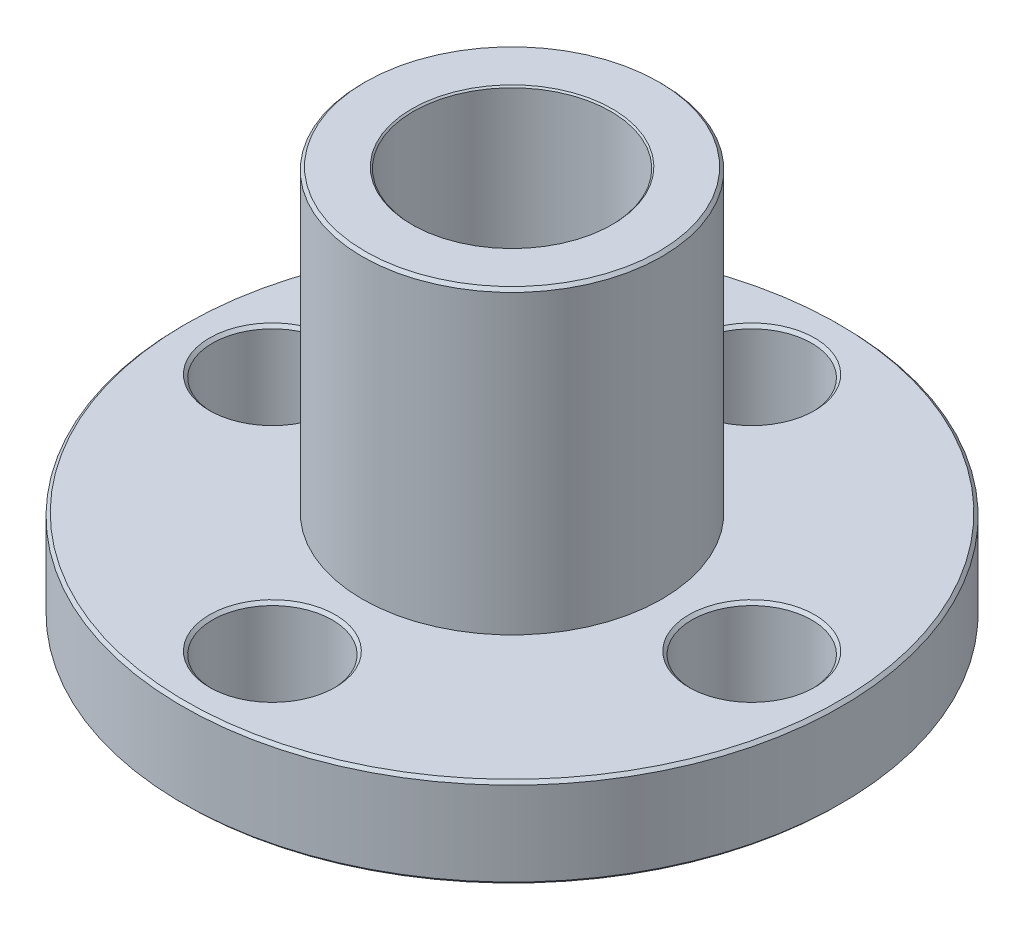
ISO-10303-21;
HEADER;
FILE_DESCRIPTION(('STEP AP214'),'2;1');
FILE_NAME('part.step','',(''),(''),'','','');
FILE_SCHEMA(('AUTOMOTIVE_DESIGN { 1 0 10303 214 1 1 1 1 }'));
ENDSEC;
DATA;
#1=APPLICATION_CONTEXT('core data for automotive mechanical design processes');
#2=APPLICATION_PROTOCOL_DEFINITION('international standard','automotive_design',2000,#1);
#3=PRODUCT_CONTEXT('',#1,'mechanical');
#4=PRODUCT('Part','Part','',(#3));
#5=PRODUCT_RELATED_PRODUCT_CATEGORY('part','',(#4));
#6=PRODUCT_DEFINITION_FORMATION('','',#4);
#7=PRODUCT_DEFINITION_CONTEXT('part definition',#1,'design');
#8=PRODUCT_DEFINITION('design','',#6,#7);
#9=PRODUCT_DEFINITION_SHAPE('','',#8);
#10=(LENGTH_UNIT() NAMED_UNIT(*) SI_UNIT(.MILLI.,.METRE.));
#11=(NAMED_UNIT(*) PLANE_ANGLE_UNIT() SI_UNIT($,.RADIAN.));
#12=(NAMED_UNIT(*) SI_UNIT($,.STERADIAN.) SOLID_ANGLE_UNIT());
#13=UNCERTAINTY_MEASURE_WITH_UNIT(LENGTH_MEASURE(1.E-05),#10,'distance_accuracy_value','');
#14=(GEOMETRIC_REPRESENTATION_CONTEXT(3) GLOBAL_UNCERTAINTY_ASSIGNED_CONTEXT((#13)) GLOBAL_UNIT_ASSIGNED_CONTEXT((#10,
#11,#12)) REPRESENTATION_CONTEXT('',''));
#15=CARTESIAN_POINT('',(0.,0.,0.));
#16=DIRECTION('',(0.,0.,1.));
#17=DIRECTION('',(1.,0.,0.));
#18=AXIS2_PLACEMENT_3D('',#15,#16,#17);
#19=CARTESIAN_POINT('',(0.,0.,0.));
#20=DIRECTION('',(0.,1.,0.));
#21=DIRECTION('',(1.,0.,0.));
#22=AXIS2_PLACEMENT_3D('',#19,#20,#21);
#23=CYLINDRICAL_SURFACE('',#22,5.);
#24=CARTESIAN_POINT('',(0.,12.9,0.));
#25=DIRECTION('',(0.,1.,0.));
#26=DIRECTION('',(1.,0.,0.));
#27=AXIS2_PLACEMENT_3D('',#24,#25,#26);
#28=CIRCLE('',#27,5.);
#29=CARTESIAN_POINT('',(-5.,12.9,0.));
#30=VERTEX_POINT('',#29);
#31=EDGE_CURVE('E26',#30,#30,#28,.T.);
#32=ORIENTED_EDGE('',*,*,#31,.F.);
#33=DIRECTION('',(0.,-1.,0.));
#34=VECTOR('',#33,1.);
#35=CARTESIAN_POINT('',(-5.,0.,0.));
#36=LINE('',#35,#34);
#37=CARTESIAN_POINT('',(-5.,3.,0.));
#38=VERTEX_POINT('',#37);
#39=EDGE_CURVE('E10',#30,#38,#36,.T.);
#40=ORIENTED_EDGE('',*,*,#39,.T.);
#41=CARTESIAN_POINT('',(0.,3.,0.));
#42=DIRECTION('',(0.,-1.,0.));
#43=DIRECTION('',(1.,0.,0.));
#44=AXIS2_PLACEMENT_3D('',#41,#42,#43);
#45=CIRCLE('',#44,5.);
#46=EDGE_CURVE('E60',#38,#38,#45,.T.);
#47=ORIENTED_EDGE('',*,*,#46,.F.);
#48=ORIENTED_EDGE('',*,*,#39,.F.);
#49=EDGE_LOOP('',(#32,#40,#47,#48));
#50=FACE_BOUND('',#49,.T.);
#51=ADVANCED_FACE('F15',(#50),#23,.T.);
#52=CARTESIAN_POINT('',(0.,12.95,0.));
#53=DIRECTION('',(0.,-1.,0.));
#54=DIRECTION('',(1.,0.,0.));
#55=AXIS2_PLACEMENT_3D('',#52,#53,#54);
#56=CONICAL_SURFACE('',#55,4.95,0.785398163397448);
#57=CARTESIAN_POINT('',(0.,13.,0.));
#58=DIRECTION('',(0.,-1.,0.));
#59=DIRECTION('',(1.,0.,0.));
#60=AXIS2_PLACEMENT_3D('',#57,#58,#59);
#61=CIRCLE('',#60,4.9);
#62=CARTESIAN_POINT('',(-4.9,13.,0.));
#63=VERTEX_POINT('',#62);
#64=EDGE_CURVE('E173',#63,#63,#61,.T.);
#65=ORIENTED_EDGE('',*,*,#64,.T.);
#66=DIRECTION('',(-0.707106781186548,-0.707106781186548,0.));
#67=VECTOR('',#66,1.);
#68=CARTESIAN_POINT('',(-4.95,12.95,0.));
#69=LINE('',#68,#67);
#70=EDGE_CURVE('E125',#63,#30,#69,.T.);
#71=ORIENTED_EDGE('',*,*,#70,.T.);
#72=ORIENTED_EDGE('',*,*,#31,.T.);
#73=ORIENTED_EDGE('',*,*,#70,.F.);
#74=EDGE_LOOP('',(#65,#71,#72,#73));
#75=FACE_BOUND('',#74,.T.);
#76=ADVANCED_FACE('F476',(#75),#56,.T.);
#77=CARTESIAN_POINT('',(0.,2.95,0.));
#78=DIRECTION('',(0.,-1.,0.));
#79=DIRECTION('',(1.,0.,0.));
#80=AXIS2_PLACEMENT_3D('',#77,#78,#79);
#81=CONICAL_SURFACE('',#80,10.95,0.785398163397448);
#82=CARTESIAN_POINT('',(0.,3.,0.));
#83=DIRECTION('',(0.,-1.,0.));
#84=DIRECTION('',(1.,0.,0.));
#85=AXIS2_PLACEMENT_3D('',#82,#83,#84);
#86=CIRCLE('',#85,10.9);
#87=CARTESIAN_POINT('',(-10.9,3.,0.));
#88=VERTEX_POINT('',#87);
#89=EDGE_CURVE('E90',#88,#88,#86,.T.);
#90=ORIENTED_EDGE('',*,*,#89,.T.);
#91=DIRECTION('',(-0.707106781186548,-0.707106781186548,0.));
#92=VECTOR('',#91,1.);
#93=CARTESIAN_POINT('',(-10.95,2.95,0.));
#94=LINE('',#93,#92);
#95=CARTESIAN_POINT('',(-11.,2.9,0.));
#96=VERTEX_POINT('',#95);
#97=EDGE_CURVE('E19',#88,#96,#94,.T.);
#98=ORIENTED_EDGE('',*,*,#97,.T.);
#99=CARTESIAN_POINT('',(0.,2.9,0.));
#100=DIRECTION('',(0.,1.,0.));
#101=DIRECTION('',(1.,0.,0.));
#102=AXIS2_PLACEMENT_3D('',#99,#100,#101);
#103=CIRCLE('',#102,11.);
#104=EDGE_CURVE('E187',#96,#96,#103,.T.);
#105=ORIENTED_EDGE('',*,*,#104,.T.);
#106=ORIENTED_EDGE('',*,*,#97,.F.);
#107=EDGE_LOOP('',(#90,#98,#105,#106));
#108=FACE_BOUND('',#107,.T.);
#109=ADVANCED_FACE('F218',(#108),#81,.T.);
#110=CARTESIAN_POINT('',(-8.00000011920929,0.,0.));
#111=DIRECTION('',(0.,1.,0.));
#112=DIRECTION('',(1.,0.,0.));
#113=AXIS2_PLACEMENT_3D('',#110,#111,#112);
#114=CYLINDRICAL_SURFACE('',#113,2.);
#115=CARTESIAN_POINT('',(-8.00000011920929,2.9,0.));
#116=DIRECTION('',(0.,-1.,0.));
#117=DIRECTION('',(1.,0.,0.));
#118=AXIS2_PLACEMENT_3D('',#115,#116,#117);
#119=CIRCLE('',#118,2.);
#120=CARTESIAN_POINT('',(-10.0000001192093,2.9,0.));
#121=VERTEX_POINT('',#120);
#122=EDGE_CURVE('E114',#121,#121,#119,.T.);
#123=ORIENTED_EDGE('',*,*,#122,.F.);
#124=DIRECTION('',(0.,-1.,0.));
#125=VECTOR('',#124,1.);
#126=CARTESIAN_POINT('',(-10.0000001192093,0.,0.));
#127=LINE('',#126,#125);
#128=CARTESIAN_POINT('',(-10.0000001192093,0.,0.));
#129=VERTEX_POINT('',#128);
#130=EDGE_CURVE('E115',#121,#129,#127,.T.);
#131=ORIENTED_EDGE('',*,*,#130,.T.);
#132=CARTESIAN_POINT('',(-8.00000011920929,0.,0.));
#133=DIRECTION('',(0.,-1.,0.));
#134=DIRECTION('',(1.,0.,0.));
#135=AXIS2_PLACEMENT_3D('',#132,#133,#134);
#136=CIRCLE('',#135,2.);
#137=EDGE_CURVE('E84',#129,#129,#136,.T.);
#138=ORIENTED_EDGE('',*,*,#137,.T.);
#139=ORIENTED_EDGE('',*,*,#130,.F.);
#140=EDGE_LOOP('',(#123,#131,#138,#139));
#141=FACE_BOUND('',#140,.T.);
#142=ADVANCED_FACE('F508',(#141),#114,.F.);
#143=CARTESIAN_POINT('',(-8.00000011920929,2.95,0.));
#144=DIRECTION('',(0.,1.,0.));
#145=DIRECTION('',(1.,0.,0.));
#146=AXIS2_PLACEMENT_3D('',#143,#144,#145);
#147=CONICAL_SURFACE('',#146,2.05,0.785398163397448);
#148=CARTESIAN_POINT('',(-8.00000011920929,3.,0.));
#149=DIRECTION('',(0.,1.,0.));
#150=DIRECTION('',(1.,0.,0.));
#151=AXIS2_PLACEMENT_3D('',#148,#149,#150);
#152=CIRCLE('',#151,2.1);
#153=CARTESIAN_POINT('',(-10.1000001192093,3.,0.));
#154=VERTEX_POINT('',#153);
#155=EDGE_CURVE('E67',#154,#154,#152,.T.);
#156=ORIENTED_EDGE('',*,*,#155,.T.);
#157=DIRECTION('',(0.707106781186548,-0.707106781186548,0.));
#158=VECTOR('',#157,1.);
#159=CARTESIAN_POINT('',(-10.0500001192093,2.95,0.));
#160=LINE('',#159,#158);
#161=EDGE_CURVE('E110',#154,#121,#160,.T.);
#162=ORIENTED_EDGE('',*,*,#161,.T.);
#163=ORIENTED_EDGE('',*,*,#122,.T.);
#164=ORIENTED_EDGE('',*,*,#161,.F.);
#165=EDGE_LOOP('',(#156,#162,#163,#164));
#166=FACE_BOUND('',#165,.T.);
#167=ADVANCED_FACE('F513',(#166),#147,.F.);
#168=CARTESIAN_POINT('',(0.,2.95,8.00000011920929));
#169=DIRECTION('',(0.,1.,0.));
#170=DIRECTION('',(1.,0.,0.));
#171=AXIS2_PLACEMENT_3D('',#168,#169,#170);
#172=CONICAL_SURFACE('',#171,2.05,0.785398163397448);
#173=CARTESIAN_POINT('',(0.,3.,8.00000011920929));
#174=DIRECTION('',(0.,1.,0.));
#175=DIRECTION('',(1.,0.,0.));
#176=AXIS2_PLACEMENT_3D('',#173,#174,#175);
#177=CIRCLE('',#176,2.1);
#178=CARTESIAN_POINT('',(-2.1,3.,8.00000011920929));
#179=VERTEX_POINT('',#178);
#180=EDGE_CURVE('E66',#179,#179,#177,.T.);
#181=ORIENTED_EDGE('',*,*,#180,.T.);
#182=DIRECTION('',(0.707106781186548,-0.707106781186548,0.));
#183=VECTOR('',#182,1.);
#184=CARTESIAN_POINT('',(-2.05,2.95,8.00000011920929));
#185=LINE('',#184,#183);
#186=CARTESIAN_POINT('',(-2.,2.9,8.00000011920929));
#187=VERTEX_POINT('',#186);
#188=EDGE_CURVE('E99',#179,#187,#185,.T.);
#189=ORIENTED_EDGE('',*,*,#188,.T.);
#190=CARTESIAN_POINT('',(0.,2.9,8.00000011920929));
#191=DIRECTION('',(0.,-1.,0.));
#192=DIRECTION('',(1.,0.,0.));
#193=AXIS2_PLACEMENT_3D('',#190,#191,#192);
#194=CIRCLE('',#193,2.);
#195=EDGE_CURVE('E82',#187,#187,#194,.T.);
#196=ORIENTED_EDGE('',*,*,#195,.T.);
#197=ORIENTED_EDGE('',*,*,#188,.F.);
#198=EDGE_LOOP('',(#181,#189,#196,#197));
#199=FACE_BOUND('',#198,.T.);
#200=ADVANCED_FACE('F504',(#199),#172,.F.);
#201=CARTESIAN_POINT('',(0.,0.,-8.00000011920929));
#202=DIRECTION('',(0.,1.,0.));
#203=DIRECTION('',(1.,0.,0.));
#204=AXIS2_PLACEMENT_3D('',#201,#202,#203);
#205=CYLINDRICAL_SURFACE('',#204,2.);
#206=CARTESIAN_POINT('',(0.,2.9,-8.00000011920929));
#207=DIRECTION('',(0.,-1.,0.));
#208=DIRECTION('',(1.,0.,0.));
#209=AXIS2_PLACEMENT_3D('',#206,#207,#208);
#210=CIRCLE('',#209,2.);
#211=CARTESIAN_POINT('',(-2.,2.9,-8.00000011920929));
#212=VERTEX_POINT('',#211);
#213=EDGE_CURVE('E100',#212,#212,#210,.T.);
#214=ORIENTED_EDGE('',*,*,#213,.F.);
#215=DIRECTION('',(0.,-1.,0.));
#216=VECTOR('',#215,1.);
#217=CARTESIAN_POINT('',(-2.,0.,-8.00000011920929));
#218=LINE('',#217,#216);
#219=CARTESIAN_POINT('',(-2.,0.,-8.00000011920929));
#220=VERTEX_POINT('',#219);
#221=EDGE_CURVE('E95',#212,#220,#218,.T.);
#222=ORIENTED_EDGE('',*,*,#221,.T.);
#223=CARTESIAN_POINT('',(0.,0.,-8.00000011920929));
#224=DIRECTION('',(0.,-1.,0.));
#225=DIRECTION('',(1.,0.,0.));
#226=AXIS2_PLACEMENT_3D('',#223,#224,#225);
#227=CIRCLE('',#226,2.);
#228=EDGE_CURVE('E88',#220,#220,#227,.T.);
#229=ORIENTED_EDGE('',*,*,#228,.T.);
#230=ORIENTED_EDGE('',*,*,#221,.F.);
#231=EDGE_LOOP('',(#214,#222,#229,#230));
#232=FACE_BOUND('',#231,.T.);
#233=ADVANCED_FACE('F511',(#232),#205,.F.);
#234=CARTESIAN_POINT('',(0.,2.95,-8.00000011920929));
#235=DIRECTION('',(0.,1.,0.));
#236=DIRECTION('',(1.,0.,0.));
#237=AXIS2_PLACEMENT_3D('',#234,#235,#236);
#238=CONICAL_SURFACE('',#237,2.05,0.785398163397448);
#239=CARTESIAN_POINT('',(0.,3.,-8.00000011920929));
#240=DIRECTION('',(0.,1.,0.));
#241=DIRECTION('',(1.,0.,0.));
#242=AXIS2_PLACEMENT_3D('',#239,#240,#241);
#243=CIRCLE('',#242,2.1);
#244=CARTESIAN_POINT('',(-2.1,3.,-8.00000011920929));
#245=VERTEX_POINT('',#244);
#246=EDGE_CURVE('E78',#245,#245,#243,.T.);
#247=ORIENTED_EDGE('',*,*,#246,.T.);
#248=DIRECTION('',(0.707106781186548,-0.707106781186548,0.));
#249=VECTOR('',#248,1.);
#250=CARTESIAN_POINT('',(-2.05,2.95,-8.00000011920929));
#251=LINE('',#250,#249);
#252=EDGE_CURVE('E75',#245,#212,#251,.T.);
#253=ORIENTED_EDGE('',*,*,#252,.T.);
#254=ORIENTED_EDGE('',*,*,#213,.T.);
#255=ORIENTED_EDGE('',*,*,#252,.F.);
#256=EDGE_LOOP('',(#247,#253,#254,#255));
#257=FACE_BOUND('',#256,.T.);
#258=ADVANCED_FACE('F202',(#257),#238,.F.);
#259=CARTESIAN_POINT('',(0.,3.,0.));
#260=DIRECTION('',(0.,1.,0.));
#261=DIRECTION('',(1.,0.,0.));
#262=AXIS2_PLACEMENT_3D('',#259,#260,#261);
#263=PLANE('',#262);
#264=CARTESIAN_POINT('',(8.00000011920929,3.,0.));
#265=DIRECTION('',(0.,1.,0.));
#266=DIRECTION('',(1.,0.,0.));
#267=AXIS2_PLACEMENT_3D('',#264,#265,#266);
#268=CIRCLE('',#267,2.1);
#269=CARTESIAN_POINT('',(5.90000011920929,3.,0.));
#270=VERTEX_POINT('',#269);
#271=EDGE_CURVE('E194',#270,#270,#268,.T.);
#272=ORIENTED_EDGE('',*,*,#271,.F.);
#273=EDGE_LOOP('',(#272));
#274=FACE_BOUND('',#273,.T.);
#275=ORIENTED_EDGE('',*,*,#180,.F.);
#276=EDGE_LOOP('',(#275));
#277=FACE_BOUND('',#276,.T.);
#278=ORIENTED_EDGE('',*,*,#46,.T.);
#279=EDGE_LOOP('',(#278));
#280=FACE_BOUND('',#279,.T.);
#281=ORIENTED_EDGE('',*,*,#155,.F.);
#282=EDGE_LOOP('',(#281));
#283=FACE_BOUND('',#282,.T.);
#284=ORIENTED_EDGE('',*,*,#246,.F.);
#285=EDGE_LOOP('',(#284));
#286=FACE_BOUND('',#285,.T.);
#287=ORIENTED_EDGE('',*,*,#89,.F.);
#288=EDGE_LOOP('',(#287));
#289=FACE_BOUND('',#288,.T.);
#290=ADVANCED_FACE('F63',(#274,#277,#280,#283,#286,#289),#263,.T.);
#291=CARTESIAN_POINT('',(8.00000011920929,2.95,0.));
#292=DIRECTION('',(0.,1.,0.));
#293=DIRECTION('',(1.,0.,0.));
#294=AXIS2_PLACEMENT_3D('',#291,#292,#293);
#295=CONICAL_SURFACE('',#294,2.05,0.785398163397448);
#296=ORIENTED_EDGE('',*,*,#271,.T.);
#297=DIRECTION('',(0.707106781186548,-0.707106781186548,0.));
#298=VECTOR('',#297,1.);
#299=CARTESIAN_POINT('',(5.95000011920929,2.95,0.));
#300=LINE('',#299,#298);
#301=CARTESIAN_POINT('',(6.00000011920929,2.9,0.));
#302=VERTEX_POINT('',#301);
#303=EDGE_CURVE('E93',#270,#302,#300,.T.);
#304=ORIENTED_EDGE('',*,*,#303,.T.);
#305=CARTESIAN_POINT('',(8.00000011920929,2.9,0.));
#306=DIRECTION('',(0.,-1.,0.));
#307=DIRECTION('',(1.,0.,0.));
#308=AXIS2_PLACEMENT_3D('',#305,#306,#307);
#309=CIRCLE('',#308,2.);
#310=EDGE_CURVE('E151',#302,#302,#309,.T.);
#311=ORIENTED_EDGE('',*,*,#310,.T.);
#312=ORIENTED_EDGE('',*,*,#303,.F.);
#313=EDGE_LOOP('',(#296,#304,#311,#312));
#314=FACE_BOUND('',#313,.T.);
#315=ADVANCED_FACE('F209',(#314),#295,.F.);
#316=CARTESIAN_POINT('',(0.,0.,0.));
#317=DIRECTION('',(0.,1.,0.));
#318=DIRECTION('',(1.,0.,0.));
#319=AXIS2_PLACEMENT_3D('',#316,#317,#318);
#320=CYLINDRICAL_SURFACE('',#319,11.);
#321=ORIENTED_EDGE('',*,*,#104,.F.);
#322=DIRECTION('',(0.,-1.,0.));
#323=VECTOR('',#322,1.);
#324=CARTESIAN_POINT('',(-11.,0.,0.));
#325=LINE('',#324,#323);
#326=CARTESIAN_POINT('',(-11.,0.1,0.));
#327=VERTEX_POINT('',#326);
#328=EDGE_CURVE('E191',#96,#327,#325,.T.);
#329=ORIENTED_EDGE('',*,*,#328,.T.);
#330=CARTESIAN_POINT('',(0.,0.1,0.));
#331=DIRECTION('',(0.,-1.,0.));
#332=DIRECTION('',(1.,0.,0.));
#333=AXIS2_PLACEMENT_3D('',#330,#331,#332);
#334=CIRCLE('',#333,11.);
#335=EDGE_CURVE('E152',#327,#327,#334,.T.);
#336=ORIENTED_EDGE('',*,*,#335,.F.);
#337=ORIENTED_EDGE('',*,*,#328,.F.);
#338=EDGE_LOOP('',(#321,#329,#336,#337));
#339=FACE_BOUND('',#338,.T.);
#340=ADVANCED_FACE('F437',(#339),#320,.T.);
#341=CARTESIAN_POINT('',(0.,0.05,0.));
#342=DIRECTION('',(0.,1.,0.));
#343=DIRECTION('',(1.,0.,0.));
#344=AXIS2_PLACEMENT_3D('',#341,#342,#343);
#345=CONICAL_SURFACE('',#344,10.95,0.785398163397449);
#346=ORIENTED_EDGE('',*,*,#335,.T.);
#347=DIRECTION('',(0.707106781186548,-0.707106781186547,0.));
#348=VECTOR('',#347,1.);
#349=CARTESIAN_POINT('',(-10.95,0.05,0.));
#350=LINE('',#349,#348);
#351=CARTESIAN_POINT('',(-10.9,0.,0.));
#352=VERTEX_POINT('',#351);
#353=EDGE_CURVE('E156',#327,#352,#350,.T.);
#354=ORIENTED_EDGE('',*,*,#353,.T.);
#355=CARTESIAN_POINT('',(0.,0.,0.));
#356=DIRECTION('',(0.,1.,0.));
#357=DIRECTION('',(1.,0.,0.));
#358=AXIS2_PLACEMENT_3D('',#355,#356,#357);
#359=CIRCLE('',#358,10.9);
#360=EDGE_CURVE('E128',#352,#352,#359,.T.);
#361=ORIENTED_EDGE('',*,*,#360,.T.);
#362=ORIENTED_EDGE('',*,*,#353,.F.);
#363=EDGE_LOOP('',(#346,#354,#361,#362));
#364=FACE_BOUND('',#363,.T.);
#365=ADVANCED_FACE('F430',(#364),#345,.T.);
#366=CARTESIAN_POINT('',(0.,0.,8.00000011920929));
#367=DIRECTION('',(0.,1.,0.));
#368=DIRECTION('',(1.,0.,0.));
#369=AXIS2_PLACEMENT_3D('',#366,#367,#368);
#370=CYLINDRICAL_SURFACE('',#369,2.);
#371=ORIENTED_EDGE('',*,*,#195,.F.);
#372=DIRECTION('',(0.,-1.,0.));
#373=VECTOR('',#372,1.);
#374=CARTESIAN_POINT('',(-2.,0.,8.00000011920929));
#375=LINE('',#374,#373);
#376=CARTESIAN_POINT('',(-2.,0.1,8.00000011920929));
#377=VERTEX_POINT('',#376);
#378=EDGE_CURVE('E157',#187,#377,#375,.T.);
#379=ORIENTED_EDGE('',*,*,#378,.T.);
#380=CARTESIAN_POINT('',(0.,0.1,8.00000011920929));
#381=DIRECTION('',(0.,1.,0.));
#382=DIRECTION('',(1.,0.,0.));
#383=AXIS2_PLACEMENT_3D('',#380,#381,#382);
#384=CIRCLE('',#383,2.);
#385=EDGE_CURVE('E142',#377,#377,#384,.T.);
#386=ORIENTED_EDGE('',*,*,#385,.F.);
#387=ORIENTED_EDGE('',*,*,#378,.F.);
#388=EDGE_LOOP('',(#371,#379,#386,#387));
#389=FACE_BOUND('',#388,.T.);
#390=ADVANCED_FACE('F535',(#389),#370,.F.);
#391=CARTESIAN_POINT('',(0.,0.05,8.00000011920929));
#392=DIRECTION('',(0.,-1.,0.));
#393=DIRECTION('',(1.,0.,0.));
#394=AXIS2_PLACEMENT_3D('',#391,#392,#393);
#395=CONICAL_SURFACE('',#394,2.05,0.785398163397449);
#396=ORIENTED_EDGE('',*,*,#385,.T.);
#397=DIRECTION('',(-0.707106781186548,-0.707106781186547,0.));
#398=VECTOR('',#397,1.);
#399=CARTESIAN_POINT('',(-2.05,0.05,8.00000011920929));
#400=LINE('',#399,#398);
#401=CARTESIAN_POINT('',(-2.1,0.,8.00000011920929));
#402=VERTEX_POINT('',#401);
#403=EDGE_CURVE('E146',#377,#402,#400,.T.);
#404=ORIENTED_EDGE('',*,*,#403,.T.);
#405=CARTESIAN_POINT('',(0.,0.,8.00000011920929));
#406=DIRECTION('',(0.,-1.,0.));
#407=DIRECTION('',(1.,0.,0.));
#408=AXIS2_PLACEMENT_3D('',#405,#406,#407);
#409=CIRCLE('',#408,2.1);
#410=EDGE_CURVE('E89',#402,#402,#409,.T.);
#411=ORIENTED_EDGE('',*,*,#410,.T.);
#412=ORIENTED_EDGE('',*,*,#403,.F.);
#413=EDGE_LOOP('',(#396,#404,#411,#412));
#414=FACE_BOUND('',#413,.T.);
#415=ADVANCED_FACE('F537',(#414),#395,.F.);
#416=CARTESIAN_POINT('',(8.00000011920929,0.,0.));
#417=DIRECTION('',(0.,1.,0.));
#418=DIRECTION('',(1.,0.,0.));
#419=AXIS2_PLACEMENT_3D('',#416,#417,#418);
#420=CYLINDRICAL_SURFACE('',#419,2.);
#421=ORIENTED_EDGE('',*,*,#310,.F.);
#422=DIRECTION('',(0.,-1.,0.));
#423=VECTOR('',#422,1.);
#424=CARTESIAN_POINT('',(6.00000011920929,0.,0.));
#425=LINE('',#424,#423);
#426=CARTESIAN_POINT('',(6.00000011920929,0.1,0.));
#427=VERTEX_POINT('',#426);
#428=EDGE_CURVE('E147',#302,#427,#425,.T.);
#429=ORIENTED_EDGE('',*,*,#428,.T.);
#430=CARTESIAN_POINT('',(8.00000011920929,0.1,0.));
#431=DIRECTION('',(0.,1.,0.));
#432=DIRECTION('',(1.,0.,0.));
#433=AXIS2_PLACEMENT_3D('',#430,#431,#432);
#434=CIRCLE('',#433,2.);
#435=EDGE_CURVE('E101',#427,#427,#434,.T.);
#436=ORIENTED_EDGE('',*,*,#435,.F.);
#437=ORIENTED_EDGE('',*,*,#428,.F.);
#438=EDGE_LOOP('',(#421,#429,#436,#437));
#439=FACE_BOUND('',#438,.T.);
#440=ADVANCED_FACE('F412',(#439),#420,.F.);
#441=CARTESIAN_POINT('',(0.,0.,0.));
#442=DIRECTION('',(0.,1.,0.));
#443=DIRECTION('',(1.,0.,0.));
#444=AXIS2_PLACEMENT_3D('',#441,#442,#443);
#445=PLANE('',#444);
#446=CARTESIAN_POINT('',(8.00000011920929,0.,0.));
#447=DIRECTION('',(0.,-1.,0.));
#448=DIRECTION('',(1.,0.,0.));
#449=AXIS2_PLACEMENT_3D('',#446,#447,#448);
#450=CIRCLE('',#449,2.1);
#451=CARTESIAN_POINT('',(5.90000011920929,0.,0.));
#452=VERTEX_POINT('',#451);
#453=EDGE_CURVE('E132',#452,#452,#450,.T.);
#454=ORIENTED_EDGE('',*,*,#453,.F.);
#455=EDGE_LOOP('',(#454));
#456=FACE_BOUND('',#455,.T.);
#457=CARTESIAN_POINT('',(0.,0.,0.));
#458=DIRECTION('',(0.,1.,0.));
#459=DIRECTION('',(1.,0.,0.));
#460=AXIS2_PLACEMENT_3D('',#457,#458,#459);
#461=CIRCLE('',#460,5.);
#462=CARTESIAN_POINT('',(-5.,0.,0.));
#463=VERTEX_POINT('',#462);
#464=EDGE_CURVE('E183',#463,#463,#461,.T.);
#465=ORIENTED_EDGE('',*,*,#464,.T.);
#466=EDGE_LOOP('',(#465));
#467=FACE_BOUND('',#466,.T.);
#468=ORIENTED_EDGE('',*,*,#228,.F.);
#469=EDGE_LOOP('',(#468));
#470=FACE_BOUND('',#469,.T.);
#471=ORIENTED_EDGE('',*,*,#137,.F.);
#472=EDGE_LOOP('',(#471));
#473=FACE_BOUND('',#472,.T.);
#474=ORIENTED_EDGE('',*,*,#410,.F.);
#475=EDGE_LOOP('',(#474));
#476=FACE_BOUND('',#475,.T.);
#477=ORIENTED_EDGE('',*,*,#360,.F.);
#478=EDGE_LOOP('',(#477));
#479=FACE_BOUND('',#478,.T.);
#480=ADVANCED_FACE('F408',(#456,#467,#470,#473,#476,#479),#445,.F.);
#481=CARTESIAN_POINT('',(8.00000011920929,0.05,0.));
#482=DIRECTION('',(0.,-1.,0.));
#483=DIRECTION('',(1.,0.,0.));
#484=AXIS2_PLACEMENT_3D('',#481,#482,#483);
#485=CONICAL_SURFACE('',#484,2.05,0.785398163397449);
#486=ORIENTED_EDGE('',*,*,#435,.T.);
#487=DIRECTION('',(-0.707106781186548,-0.707106781186547,0.));
#488=VECTOR('',#487,1.);
#489=CARTESIAN_POINT('',(5.95000011920929,0.05,0.));
#490=LINE('',#489,#488);
#491=EDGE_CURVE('E105',#427,#452,#490,.T.);
#492=ORIENTED_EDGE('',*,*,#491,.T.);
#493=ORIENTED_EDGE('',*,*,#453,.T.);
#494=ORIENTED_EDGE('',*,*,#491,.F.);
#495=EDGE_LOOP('',(#486,#492,#493,#494));
#496=FACE_BOUND('',#495,.T.);
#497=ADVANCED_FACE('F411',(#496),#485,.F.);
#498=CARTESIAN_POINT('',(0.,0.,0.));
#499=DIRECTION('',(0.,1.,0.));
#500=DIRECTION('',(1.,0.,0.));
#501=AXIS2_PLACEMENT_3D('',#498,#499,#500);
#502=CYLINDRICAL_SURFACE('',#501,5.);
#503=ORIENTED_EDGE('',*,*,#464,.F.);
#504=DIRECTION('',(0.,-1.,0.));
#505=VECTOR('',#504,1.);
#506=CARTESIAN_POINT('',(-5.,0.,0.));
#507=LINE('',#506,#505);
#508=CARTESIAN_POINT('',(-5.,-1.9,0.));
#509=VERTEX_POINT('',#508);
#510=EDGE_CURVE('E106',#463,#509,#507,.T.);
#511=ORIENTED_EDGE('',*,*,#510,.T.);
#512=CARTESIAN_POINT('',(0.,-1.9,0.));
#513=DIRECTION('',(0.,-1.,0.));
#514=DIRECTION('',(1.,0.,0.));
#515=AXIS2_PLACEMENT_3D('',#512,#513,#514);
#516=CIRCLE('',#515,5.);
#517=EDGE_CURVE('E299',#509,#509,#516,.T.);
#518=ORIENTED_EDGE('',*,*,#517,.F.);
#519=ORIENTED_EDGE('',*,*,#510,.F.);
#520=EDGE_LOOP('',(#503,#511,#518,#519));
#521=FACE_BOUND('',#520,.T.);
#522=ADVANCED_FACE('F403',(#521),#502,.T.);
#523=CARTESIAN_POINT('',(0.,-1.95,0.));
#524=DIRECTION('',(0.,1.,0.));
#525=DIRECTION('',(1.,0.,0.));
#526=AXIS2_PLACEMENT_3D('',#523,#524,#525);
#527=CONICAL_SURFACE('',#526,4.95,0.785398163397448);
#528=CARTESIAN_POINT('',(0.,-2.,0.));
#529=DIRECTION('',(0.,1.,0.));
#530=DIRECTION('',(1.,0.,0.));
#531=AXIS2_PLACEMENT_3D('',#528,#529,#530);
#532=CIRCLE('',#531,4.9);
#533=CARTESIAN_POINT('',(-4.9,-2.,0.));
#534=VERTEX_POINT('',#533);
#535=EDGE_CURVE('E119',#534,#534,#532,.T.);
#536=ORIENTED_EDGE('',*,*,#535,.T.);
#537=DIRECTION('',(-0.707106781186548,0.707106781186548,0.));
#538=VECTOR('',#537,1.);
#539=CARTESIAN_POINT('',(-4.95,-1.95,0.));
#540=LINE('',#539,#538);
#541=EDGE_CURVE('E123',#534,#509,#540,.T.);
#542=ORIENTED_EDGE('',*,*,#541,.T.);
#543=ORIENTED_EDGE('',*,*,#517,.T.);
#544=ORIENTED_EDGE('',*,*,#541,.F.);
#545=EDGE_LOOP('',(#536,#542,#543,#544));
#546=FACE_BOUND('',#545,.T.);
#547=ADVANCED_FACE('F395',(#546),#527,.T.);
#548=CARTESIAN_POINT('',(0.,-2.,0.));
#549=DIRECTION('',(0.,1.,0.));
#550=DIRECTION('',(1.,0.,0.));
#551=AXIS2_PLACEMENT_3D('',#548,#549,#550);
#552=PLANE('',#551);
#553=CARTESIAN_POINT('',(0.,-2.,0.));
#554=DIRECTION('',(0.,-1.,0.));
#555=DIRECTION('',(1.,0.,0.));
#556=AXIS2_PLACEMENT_3D('',#553,#554,#555);
#557=CIRCLE('',#556,3.3475);
#558=CARTESIAN_POINT('',(-3.3475,-2.,0.));
#559=VERTEX_POINT('',#558);
#560=EDGE_CURVE('E287',#559,#559,#557,.T.);
#561=ORIENTED_EDGE('',*,*,#560,.F.);
#562=EDGE_LOOP('',(#561));
#563=FACE_BOUND('',#562,.T.);
#564=ORIENTED_EDGE('',*,*,#535,.F.);
#565=EDGE_LOOP('',(#564));
#566=FACE_BOUND('',#565,.T.);
#567=ADVANCED_FACE('F491',(#563,#566),#552,.F.);
#568=CARTESIAN_POINT('',(0.,-1.975,0.));
#569=DIRECTION('',(0.,-1.,0.));
#570=DIRECTION('',(1.,0.,0.));
#571=AXIS2_PLACEMENT_3D('',#568,#569,#570);
#572=CONICAL_SURFACE('',#571,3.3225,0.785398163397448);
#573=ORIENTED_EDGE('',*,*,#560,.T.);
#574=DIRECTION('',(0.707106781186548,0.707106781186548,0.));
#575=VECTOR('',#574,1.);
#576=CARTESIAN_POINT('',(-3.3225,-1.975,0.));
#577=LINE('',#576,#575);
#578=CARTESIAN_POINT('',(-3.2975,-1.95,0.));
#579=VERTEX_POINT('',#578);
#580=EDGE_CURVE('E124',#559,#579,#577,.T.);
#581=ORIENTED_EDGE('',*,*,#580,.T.);
#582=CARTESIAN_POINT('',(0.,-1.95,0.));
#583=DIRECTION('',(0.,1.,0.));
#584=DIRECTION('',(1.,0.,0.));
#585=AXIS2_PLACEMENT_3D('',#582,#583,#584);
#586=CIRCLE('',#585,3.2975);
#587=EDGE_CURVE('E168',#579,#579,#586,.T.);
#588=ORIENTED_EDGE('',*,*,#587,.T.);
#589=ORIENTED_EDGE('',*,*,#580,.F.);
#590=EDGE_LOOP('',(#573,#581,#588,#589));
#591=FACE_BOUND('',#590,.T.);
#592=ADVANCED_FACE('F17',(#591),#572,.F.);
#593=CARTESIAN_POINT('',(0.,13.,0.));
#594=DIRECTION('',(0.,1.,0.));
#595=DIRECTION('',(1.,0.,0.));
#596=AXIS2_PLACEMENT_3D('',#593,#594,#595);
#597=PLANE('',#596);
#598=CARTESIAN_POINT('',(0.,13.,0.));
#599=DIRECTION('',(0.,1.,0.));
#600=DIRECTION('',(1.,0.,0.));
#601=AXIS2_PLACEMENT_3D('',#598,#599,#600);
#602=CIRCLE('',#601,3.3475);
#603=CARTESIAN_POINT('',(-3.3475,13.,0.));
#604=VERTEX_POINT('',#603);
#605=EDGE_CURVE('E303',#604,#604,#602,.T.);
#606=ORIENTED_EDGE('',*,*,#605,.F.);
#607=EDGE_LOOP('',(#606));
#608=FACE_BOUND('',#607,.T.);
#609=ORIENTED_EDGE('',*,*,#64,.F.);
#610=EDGE_LOOP('',(#609));
#611=FACE_BOUND('',#610,.T.);
#612=ADVANCED_FACE('F479',(#608,#611),#597,.T.);
#613=CARTESIAN_POINT('',(0.,0.,0.));
#614=DIRECTION('',(0.,1.,0.));
#615=DIRECTION('',(1.,0.,0.));
#616=AXIS2_PLACEMENT_3D('',#613,#614,#615);
#617=CYLINDRICAL_SURFACE('',#616,3.2975);
#618=CARTESIAN_POINT('',(0.,12.95,0.));
#619=DIRECTION('',(0.,-1.,0.));
#620=DIRECTION('',(1.,0.,0.));
#621=AXIS2_PLACEMENT_3D('',#618,#619,#620);
#622=CIRCLE('',#621,3.2975);
#623=CARTESIAN_POINT('',(-3.2975,12.95,0.));
#624=VERTEX_POINT('',#623);
#625=EDGE_CURVE('E169',#624,#624,#622,.T.);
#626=ORIENTED_EDGE('',*,*,#625,.F.);
#627=DIRECTION('',(0.,-1.,0.));
#628=VECTOR('',#627,1.);
#629=CARTESIAN_POINT('',(-3.2975,0.,0.));
#630=LINE('',#629,#628);
#631=EDGE_CURVE('E164',#624,#579,#630,.T.);
#632=ORIENTED_EDGE('',*,*,#631,.T.);
#633=ORIENTED_EDGE('',*,*,#587,.F.);
#634=ORIENTED_EDGE('',*,*,#631,.F.);
#635=EDGE_LOOP('',(#626,#632,#633,#634));
#636=FACE_BOUND('',#635,.T.);
#637=ADVANCED_FACE('F481',(#636),#617,.F.);
#638=CARTESIAN_POINT('',(0.,12.975,0.));
#639=DIRECTION('',(0.,1.,0.));
#640=DIRECTION('',(1.,0.,0.));
#641=AXIS2_PLACEMENT_3D('',#638,#639,#640);
#642=CONICAL_SURFACE('',#641,3.3225,0.785398163397459);
#643=ORIENTED_EDGE('',*,*,#605,.T.);
#644=DIRECTION('',(0.707106781186555,-0.70710678118654,0.));
#645=VECTOR('',#644,1.);
#646=CARTESIAN_POINT('',(-3.3225,12.975,0.));
#647=LINE('',#646,#645);
#648=EDGE_CURVE('E307',#604,#624,#647,.T.);
#649=ORIENTED_EDGE('',*,*,#648,.T.);
#650=ORIENTED_EDGE('',*,*,#625,.T.);
#651=ORIENTED_EDGE('',*,*,#648,.F.);
#652=EDGE_LOOP('',(#643,#649,#650,#651));
#653=FACE_BOUND('',#652,.T.);
#654=ADVANCED_FACE('F369',(#653),#642,.F.);
#655=CLOSED_SHELL('',(#51,#76,#109,#142,#167,#200,#233,#258,#290,#315,#340,#365,#390,#415,#440,
#480,#497,#522,#547,#567,#592,#612,#637,#654));
#656=MANIFOLD_SOLID_BREP('B1',#655);
#657=ADVANCED_BREP_SHAPE_REPRESENTATION('',(#18,#656),#14);
#658=SHAPE_DEFINITION_REPRESENTATION(#9,#657);
ENDSEC;
END-ISO-10303-21;
